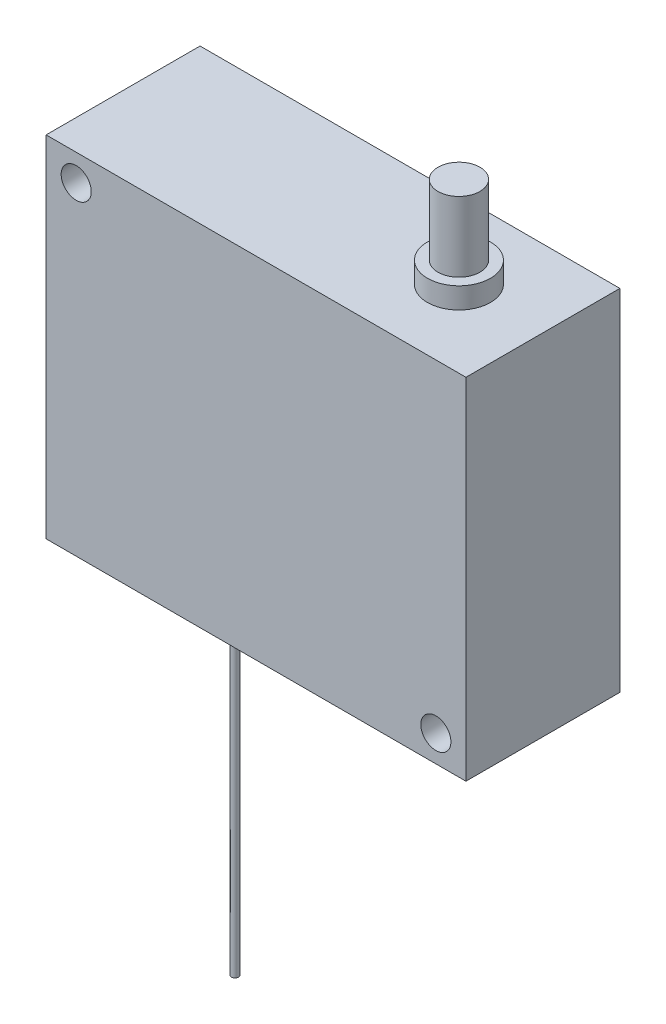
ISO-10303-21;
HEADER;
FILE_DESCRIPTION(('STEP AP214'),'2;1');
FILE_NAME('part.step','',(''),(''),'','','');
FILE_SCHEMA(('AUTOMOTIVE_DESIGN { 1 0 10303 214 1 1 1 1 }'));
ENDSEC;
DATA;
#1=APPLICATION_CONTEXT('core data for automotive mechanical design processes');
#2=APPLICATION_PROTOCOL_DEFINITION('international standard','automotive_design',2000,#1);
#3=PRODUCT_CONTEXT('',#1,'mechanical');
#4=PRODUCT('Part','Part','',(#3));
#5=PRODUCT_RELATED_PRODUCT_CATEGORY('part','',(#4));
#6=PRODUCT_DEFINITION_FORMATION('','',#4);
#7=PRODUCT_DEFINITION_CONTEXT('part definition',#1,'design');
#8=PRODUCT_DEFINITION('design','',#6,#7);
#9=PRODUCT_DEFINITION_SHAPE('','',#8);
#10=(LENGTH_UNIT() NAMED_UNIT(*) SI_UNIT(.MILLI.,.METRE.));
#11=(NAMED_UNIT(*) PLANE_ANGLE_UNIT() SI_UNIT($,.RADIAN.));
#12=(NAMED_UNIT(*) SI_UNIT($,.STERADIAN.) SOLID_ANGLE_UNIT());
#13=UNCERTAINTY_MEASURE_WITH_UNIT(LENGTH_MEASURE(1.E-05),#10,'distance_accuracy_value','');
#14=(GEOMETRIC_REPRESENTATION_CONTEXT(3) GLOBAL_UNCERTAINTY_ASSIGNED_CONTEXT((#13)) GLOBAL_UNIT_ASSIGNED_CONTEXT((#10,
#11,#12)) REPRESENTATION_CONTEXT('',''));
#15=CARTESIAN_POINT('',(0.,0.,0.));
#16=DIRECTION('',(0.,0.,1.));
#17=DIRECTION('',(1.,0.,0.));
#18=AXIS2_PLACEMENT_3D('',#15,#16,#17);
#19=CARTESIAN_POINT('',(0.,0.,22.));
#20=DIRECTION('',(0.,1.,0.));
#21=DIRECTION('',(0.,0.,1.));
#22=AXIS2_PLACEMENT_3D('',#19,#20,#21);
#23=PLANE('',#22);
#24=DIRECTION('',(1.,0.,0.));
#25=VECTOR('',#24,1.);
#26=CARTESIAN_POINT('',(3.,0.,3.5));
#27=LINE('',#26,#25);
#28=CARTESIAN_POINT('',(3.,0.,3.5));
#29=VERTEX_POINT('',#28);
#30=CARTESIAN_POINT('',(42.,0.,3.5));
#31=VERTEX_POINT('',#30);
#32=EDGE_CURVE('E114',#29,#31,#27,.T.);
#33=ORIENTED_EDGE('',*,*,#32,.F.);
#34=DIRECTION('',(0.,0.,-1.));
#35=VECTOR('',#34,1.);
#36=CARTESIAN_POINT('',(3.,0.,11.5));
#37=LINE('',#36,#35);
#38=CARTESIAN_POINT('',(3.,0.,11.5));
#39=VERTEX_POINT('',#38);
#40=EDGE_CURVE('E107',#39,#29,#37,.T.);
#41=ORIENTED_EDGE('',*,*,#40,.F.);
#42=DIRECTION('',(-1.,0.,0.));
#43=VECTOR('',#42,1.);
#44=CARTESIAN_POINT('',(3.,0.,11.5));
#45=LINE('',#44,#43);
#46=CARTESIAN_POINT('',(42.,0.,11.5));
#47=VERTEX_POINT('',#46);
#48=EDGE_CURVE('E129',#47,#39,#45,.T.);
#49=ORIENTED_EDGE('',*,*,#48,.F.);
#50=DIRECTION('',(0.,0.,1.));
#51=VECTOR('',#50,1.);
#52=CARTESIAN_POINT('',(42.,0.,11.5));
#53=LINE('',#52,#51);
#54=EDGE_CURVE('E137',#31,#47,#53,.T.);
#55=ORIENTED_EDGE('',*,*,#54,.F.);
#56=EDGE_LOOP('',(#33,#41,#49,#55));
#57=FACE_BOUND('',#56,.T.);
#58=DIRECTION('',(1.,0.,0.));
#59=VECTOR('',#58,1.);
#60=CARTESIAN_POINT('',(0.,0.,0.));
#61=LINE('',#60,#59);
#62=CARTESIAN_POINT('',(0.,0.,0.));
#63=VERTEX_POINT('',#62);
#64=CARTESIAN_POINT('',(60.,0.,0.));
#65=VERTEX_POINT('',#64);
#66=EDGE_CURVE('E169',#63,#65,#61,.T.);
#67=ORIENTED_EDGE('',*,*,#66,.T.);
#68=DIRECTION('',(0.,0.,-1.));
#69=VECTOR('',#68,1.);
#70=CARTESIAN_POINT('',(60.,0.,22.));
#71=LINE('',#70,#69);
#72=CARTESIAN_POINT('',(60.,0.,22.));
#73=VERTEX_POINT('',#72);
#74=EDGE_CURVE('E158',#73,#65,#71,.T.);
#75=ORIENTED_EDGE('',*,*,#74,.F.);
#76=DIRECTION('',(1.,0.,0.));
#77=VECTOR('',#76,1.);
#78=CARTESIAN_POINT('',(0.,0.,22.));
#79=LINE('',#78,#77);
#80=CARTESIAN_POINT('',(0.,0.,22.));
#81=VERTEX_POINT('',#80);
#82=EDGE_CURVE('E157',#81,#73,#79,.T.);
#83=ORIENTED_EDGE('',*,*,#82,.F.);
#84=DIRECTION('',(0.,0.,-1.));
#85=VECTOR('',#84,1.);
#86=CARTESIAN_POINT('',(0.,0.,22.));
#87=LINE('',#86,#85);
#88=EDGE_CURVE('E153',#81,#63,#87,.T.);
#89=ORIENTED_EDGE('',*,*,#88,.T.);
#90=EDGE_LOOP('',(#67,#75,#83,#89));
#91=FACE_BOUND('',#90,.T.);
#92=ADVANCED_FACE('F44',(#57,#91),#23,.F.);
#93=CARTESIAN_POINT('',(48.,53.,11.));
#94=DIRECTION('',(0.,1.,0.));
#95=DIRECTION('',(0.,0.,1.));
#96=AXIS2_PLACEMENT_3D('',#93,#94,#95);
#97=PLANE('',#96);
#98=CARTESIAN_POINT('',(48.,53.,11.));
#99=DIRECTION('',(0.,1.,0.));
#100=DIRECTION('',(0.,0.,1.));
#101=AXIS2_PLACEMENT_3D('',#98,#99,#100);
#102=CIRCLE('',#101,4.5);
#103=CARTESIAN_POINT('',(48.,53.,15.5));
#104=VERTEX_POINT('',#103);
#105=EDGE_CURVE('E149',#104,#104,#102,.T.);
#106=ORIENTED_EDGE('',*,*,#105,.T.);
#107=EDGE_LOOP('',(#106));
#108=FACE_BOUND('',#107,.T.);
#109=CARTESIAN_POINT('',(48.,53.,11.));
#110=DIRECTION('',(0.,1.,0.));
#111=DIRECTION('',(0.,0.,1.));
#112=AXIS2_PLACEMENT_3D('',#109,#110,#111);
#113=CIRCLE('',#112,3.);
#114=CARTESIAN_POINT('',(48.,53.,14.));
#115=VERTEX_POINT('',#114);
#116=EDGE_CURVE('E145',#115,#115,#113,.T.);
#117=ORIENTED_EDGE('',*,*,#116,.F.);
#118=EDGE_LOOP('',(#117));
#119=FACE_BOUND('',#118,.T.);
#120=ADVANCED_FACE('F243',(#108,#119),#97,.T.);
#121=CARTESIAN_POINT('',(0.,50.,22.));
#122=DIRECTION('',(0.,-1.,0.));
#123=DIRECTION('',(0.,0.,-1.));
#124=AXIS2_PLACEMENT_3D('',#121,#122,#123);
#125=PLANE('',#124);
#126=DIRECTION('',(-1.,0.,0.));
#127=VECTOR('',#126,1.);
#128=CARTESIAN_POINT('',(0.,50.,0.));
#129=LINE('',#128,#127);
#130=CARTESIAN_POINT('',(60.,50.,0.));
#131=VERTEX_POINT('',#130);
#132=CARTESIAN_POINT('',(0.,50.,0.));
#133=VERTEX_POINT('',#132);
#134=EDGE_CURVE('E152',#131,#133,#129,.T.);
#135=ORIENTED_EDGE('',*,*,#134,.T.);
#136=DIRECTION('',(0.,0.,-1.));
#137=VECTOR('',#136,1.);
#138=CARTESIAN_POINT('',(0.,50.,22.));
#139=LINE('',#138,#137);
#140=CARTESIAN_POINT('',(0.,50.,22.));
#141=VERTEX_POINT('',#140);
#142=EDGE_CURVE('E167',#141,#133,#139,.T.);
#143=ORIENTED_EDGE('',*,*,#142,.F.);
#144=DIRECTION('',(-1.,0.,0.));
#145=VECTOR('',#144,1.);
#146=CARTESIAN_POINT('',(0.,50.,22.));
#147=LINE('',#146,#145);
#148=CARTESIAN_POINT('',(60.,50.,22.));
#149=VERTEX_POINT('',#148);
#150=EDGE_CURVE('E162',#149,#141,#147,.T.);
#151=ORIENTED_EDGE('',*,*,#150,.F.);
#152=DIRECTION('',(0.,0.,-1.));
#153=VECTOR('',#152,1.);
#154=CARTESIAN_POINT('',(60.,50.,22.));
#155=LINE('',#154,#153);
#156=EDGE_CURVE('E168',#149,#131,#155,.T.);
#157=ORIENTED_EDGE('',*,*,#156,.T.);
#158=EDGE_LOOP('',(#135,#143,#151,#157));
#159=FACE_BOUND('',#158,.T.);
#160=CARTESIAN_POINT('',(48.,50.,11.));
#161=DIRECTION('',(0.,-1.,0.));
#162=DIRECTION('',(0.,0.,-1.));
#163=AXIS2_PLACEMENT_3D('',#160,#161,#162);
#164=CIRCLE('',#163,4.5);
#165=CARTESIAN_POINT('',(48.,50.,6.5));
#166=VERTEX_POINT('',#165);
#167=EDGE_CURVE('E148',#166,#166,#164,.F.);
#168=ORIENTED_EDGE('',*,*,#167,.F.);
#169=EDGE_LOOP('',(#168));
#170=FACE_BOUND('',#169,.T.);
#171=ADVANCED_FACE('F229',(#159,#170),#125,.F.);
#172=CARTESIAN_POINT('',(0.,0.,22.));
#173=DIRECTION('',(1.,0.,0.));
#174=DIRECTION('',(0.,0.,-1.));
#175=AXIS2_PLACEMENT_3D('',#172,#173,#174);
#176=PLANE('',#175);
#177=DIRECTION('',(0.,-1.,0.));
#178=VECTOR('',#177,1.);
#179=CARTESIAN_POINT('',(0.,0.,0.));
#180=LINE('',#179,#178);
#181=EDGE_CURVE('E164',#133,#63,#180,.T.);
#182=ORIENTED_EDGE('',*,*,#181,.T.);
#183=ORIENTED_EDGE('',*,*,#88,.F.);
#184=DIRECTION('',(0.,-1.,0.));
#185=VECTOR('',#184,1.);
#186=CARTESIAN_POINT('',(0.,0.,22.));
#187=LINE('',#186,#185);
#188=EDGE_CURVE('E154',#141,#81,#187,.T.);
#189=ORIENTED_EDGE('',*,*,#188,.F.);
#190=ORIENTED_EDGE('',*,*,#142,.T.);
#191=EDGE_LOOP('',(#182,#183,#189,#190));
#192=FACE_BOUND('',#191,.T.);
#193=ADVANCED_FACE('F220',(#192),#176,.F.);
#194=CARTESIAN_POINT('',(60.,0.,22.));
#195=DIRECTION('',(-1.,0.,0.));
#196=DIRECTION('',(0.,0.,1.));
#197=AXIS2_PLACEMENT_3D('',#194,#195,#196);
#198=PLANE('',#197);
#199=DIRECTION('',(0.,1.,0.));
#200=VECTOR('',#199,1.);
#201=CARTESIAN_POINT('',(60.,0.,0.));
#202=LINE('',#201,#200);
#203=EDGE_CURVE('E172',#65,#131,#202,.T.);
#204=ORIENTED_EDGE('',*,*,#203,.T.);
#205=ORIENTED_EDGE('',*,*,#156,.F.);
#206=DIRECTION('',(0.,1.,0.));
#207=VECTOR('',#206,1.);
#208=CARTESIAN_POINT('',(60.,0.,22.));
#209=LINE('',#208,#207);
#210=EDGE_CURVE('E160',#73,#149,#209,.T.);
#211=ORIENTED_EDGE('',*,*,#210,.F.);
#212=ORIENTED_EDGE('',*,*,#74,.T.);
#213=EDGE_LOOP('',(#204,#205,#211,#212));
#214=FACE_BOUND('',#213,.T.);
#215=ADVANCED_FACE('F210',(#214),#198,.F.);
#216=CARTESIAN_POINT('',(0.,0.,22.));
#217=DIRECTION('',(0.,0.,-1.));
#218=DIRECTION('',(-1.,0.,0.));
#219=AXIS2_PLACEMENT_3D('',#216,#217,#218);
#220=PLANE('',#219);
#221=CARTESIAN_POINT('',(4.30000000000001,46.2,22.));
#222=DIRECTION('',(0.,0.,1.));
#223=DIRECTION('',(1.,0.,0.));
#224=AXIS2_PLACEMENT_3D('',#221,#222,#223);
#225=CIRCLE('',#224,2.15);
#226=CARTESIAN_POINT('',(6.45000000000001,46.2,22.));
#227=VERTEX_POINT('',#226);
#228=EDGE_CURVE('E191',#227,#227,#225,.T.);
#229=ORIENTED_EDGE('',*,*,#228,.F.);
#230=EDGE_LOOP('',(#229));
#231=FACE_BOUND('',#230,.T.);
#232=CARTESIAN_POINT('',(55.7,3.8,22.));
#233=DIRECTION('',(0.,0.,1.));
#234=DIRECTION('',(1.,0.,0.));
#235=AXIS2_PLACEMENT_3D('',#232,#233,#234);
#236=CIRCLE('',#235,2.15);
#237=CARTESIAN_POINT('',(57.85,3.8,22.));
#238=VERTEX_POINT('',#237);
#239=EDGE_CURVE('E185',#238,#238,#236,.T.);
#240=ORIENTED_EDGE('',*,*,#239,.F.);
#241=EDGE_LOOP('',(#240));
#242=FACE_BOUND('',#241,.T.);
#243=ORIENTED_EDGE('',*,*,#188,.T.);
#244=ORIENTED_EDGE('',*,*,#82,.T.);
#245=ORIENTED_EDGE('',*,*,#210,.T.);
#246=ORIENTED_EDGE('',*,*,#150,.T.);
#247=EDGE_LOOP('',(#243,#244,#245,#246));
#248=FACE_BOUND('',#247,.T.);
#249=ADVANCED_FACE('F207',(#231,#242,#248),#220,.F.);
#250=CARTESIAN_POINT('',(0.,0.,0.));
#251=DIRECTION('',(0.,0.,-1.));
#252=DIRECTION('',(-1.,0.,0.));
#253=AXIS2_PLACEMENT_3D('',#250,#251,#252);
#254=PLANE('',#253);
#255=CARTESIAN_POINT('',(4.30000000000001,46.2,0.));
#256=DIRECTION('',(0.,0.,1.));
#257=DIRECTION('',(1.,0.,0.));
#258=AXIS2_PLACEMENT_3D('',#255,#256,#257);
#259=CIRCLE('',#258,2.15);
#260=CARTESIAN_POINT('',(6.45000000000001,46.2,0.));
#261=VERTEX_POINT('',#260);
#262=EDGE_CURVE('E188',#261,#261,#259,.T.);
#263=ORIENTED_EDGE('',*,*,#262,.T.);
#264=EDGE_LOOP('',(#263));
#265=FACE_BOUND('',#264,.T.);
#266=CARTESIAN_POINT('',(55.7,3.8,0.));
#267=DIRECTION('',(0.,0.,1.));
#268=DIRECTION('',(1.,0.,0.));
#269=AXIS2_PLACEMENT_3D('',#266,#267,#268);
#270=CIRCLE('',#269,2.15);
#271=CARTESIAN_POINT('',(57.85,3.8,0.));
#272=VERTEX_POINT('',#271);
#273=EDGE_CURVE('E171',#272,#272,#270,.T.);
#274=ORIENTED_EDGE('',*,*,#273,.T.);
#275=EDGE_LOOP('',(#274));
#276=FACE_BOUND('',#275,.T.);
#277=ORIENTED_EDGE('',*,*,#181,.F.);
#278=ORIENTED_EDGE('',*,*,#134,.F.);
#279=ORIENTED_EDGE('',*,*,#203,.F.);
#280=ORIENTED_EDGE('',*,*,#66,.F.);
#281=EDGE_LOOP('',(#277,#278,#279,#280));
#282=FACE_BOUND('',#281,.T.);
#283=ADVANCED_FACE('F197',(#265,#276,#282),#254,.T.);
#284=CARTESIAN_POINT('',(48.,53.,11.));
#285=DIRECTION('',(0.,-1.,0.));
#286=DIRECTION('',(0.,0.,-1.));
#287=AXIS2_PLACEMENT_3D('',#284,#285,#286);
#288=CYLINDRICAL_SURFACE('',#287,4.5);
#289=ORIENTED_EDGE('',*,*,#105,.F.);
#290=EDGE_LOOP('',(#289));
#291=FACE_BOUND('',#290,.T.);
#292=ORIENTED_EDGE('',*,*,#167,.T.);
#293=EDGE_LOOP('',(#292));
#294=FACE_BOUND('',#293,.T.);
#295=ADVANCED_FACE('F233',(#291,#294),#288,.T.);
#296=CARTESIAN_POINT('',(48.,63.,11.));
#297=DIRECTION('',(0.,-1.,0.));
#298=DIRECTION('',(0.,0.,-1.));
#299=AXIS2_PLACEMENT_3D('',#296,#297,#298);
#300=CYLINDRICAL_SURFACE('',#299,3.);
#301=CARTESIAN_POINT('',(48.,63.,11.));
#302=DIRECTION('',(0.,1.,0.));
#303=DIRECTION('',(0.,0.,1.));
#304=AXIS2_PLACEMENT_3D('',#301,#302,#303);
#305=CIRCLE('',#304,3.);
#306=CARTESIAN_POINT('',(48.,63.,14.));
#307=VERTEX_POINT('',#306);
#308=EDGE_CURVE('E132',#307,#307,#305,.T.);
#309=ORIENTED_EDGE('',*,*,#308,.F.);
#310=EDGE_LOOP('',(#309));
#311=FACE_BOUND('',#310,.T.);
#312=ORIENTED_EDGE('',*,*,#116,.T.);
#313=EDGE_LOOP('',(#312));
#314=FACE_BOUND('',#313,.T.);
#315=ADVANCED_FACE('F238',(#311,#314),#300,.T.);
#316=CARTESIAN_POINT('',(48.,63.,11.));
#317=DIRECTION('',(0.,1.,0.));
#318=DIRECTION('',(0.,0.,1.));
#319=AXIS2_PLACEMENT_3D('',#316,#317,#318);
#320=PLANE('',#319);
#321=ORIENTED_EDGE('',*,*,#308,.T.);
#322=EDGE_LOOP('',(#321));
#323=FACE_BOUND('',#322,.T.);
#324=ADVANCED_FACE('F320',(#323),#320,.T.);
#325=CARTESIAN_POINT('',(3.,0.01,11.5));
#326=DIRECTION('',(-1.,0.,0.));
#327=DIRECTION('',(0.,0.,1.));
#328=AXIS2_PLACEMENT_3D('',#325,#326,#327);
#329=PLANE('',#328);
#330=ORIENTED_EDGE('',*,*,#40,.T.);
#331=DIRECTION('',(0.,-1.,0.));
#332=VECTOR('',#331,1.);
#333=CARTESIAN_POINT('',(3.,0.01,3.5));
#334=LINE('',#333,#332);
#335=CARTESIAN_POINT('',(3.,0.01,3.5));
#336=VERTEX_POINT('',#335);
#337=EDGE_CURVE('E110',#336,#29,#334,.T.);
#338=ORIENTED_EDGE('',*,*,#337,.F.);
#339=DIRECTION('',(0.,0.,-1.));
#340=VECTOR('',#339,1.);
#341=CARTESIAN_POINT('',(3.,0.01,11.5));
#342=LINE('',#341,#340);
#343=CARTESIAN_POINT('',(3.,0.01,11.5));
#344=VERTEX_POINT('',#343);
#345=EDGE_CURVE('E48',#344,#336,#342,.T.);
#346=ORIENTED_EDGE('',*,*,#345,.F.);
#347=DIRECTION('',(0.,-1.,0.));
#348=VECTOR('',#347,1.);
#349=CARTESIAN_POINT('',(3.,0.01,11.5));
#350=LINE('',#349,#348);
#351=EDGE_CURVE('E127',#344,#39,#350,.T.);
#352=ORIENTED_EDGE('',*,*,#351,.T.);
#353=EDGE_LOOP('',(#330,#338,#346,#352));
#354=FACE_BOUND('',#353,.T.);
#355=ADVANCED_FACE('F111',(#354),#329,.F.);
#356=CARTESIAN_POINT('',(3.,0.01,11.5));
#357=DIRECTION('',(0.,0.,1.));
#358=DIRECTION('',(1.,0.,0.));
#359=AXIS2_PLACEMENT_3D('',#356,#357,#358);
#360=PLANE('',#359);
#361=ORIENTED_EDGE('',*,*,#48,.T.);
#362=ORIENTED_EDGE('',*,*,#351,.F.);
#363=DIRECTION('',(-1.,0.,0.));
#364=VECTOR('',#363,1.);
#365=CARTESIAN_POINT('',(3.,0.01,11.5));
#366=LINE('',#365,#364);
#367=CARTESIAN_POINT('',(42.,0.01,11.5));
#368=VERTEX_POINT('',#367);
#369=EDGE_CURVE('E12',#368,#344,#366,.T.);
#370=ORIENTED_EDGE('',*,*,#369,.F.);
#371=DIRECTION('',(0.,-1.,0.));
#372=VECTOR('',#371,1.);
#373=CARTESIAN_POINT('',(42.,0.01,11.5));
#374=LINE('',#373,#372);
#375=EDGE_CURVE('E125',#368,#47,#374,.T.);
#376=ORIENTED_EDGE('',*,*,#375,.T.);
#377=EDGE_LOOP('',(#361,#362,#370,#376));
#378=FACE_BOUND('',#377,.T.);
#379=ADVANCED_FACE('F124',(#378),#360,.F.);
#380=CARTESIAN_POINT('',(42.,0.01,11.5));
#381=DIRECTION('',(1.,0.,0.));
#382=DIRECTION('',(0.,0.,-1.));
#383=AXIS2_PLACEMENT_3D('',#380,#381,#382);
#384=PLANE('',#383);
#385=ORIENTED_EDGE('',*,*,#54,.T.);
#386=ORIENTED_EDGE('',*,*,#375,.F.);
#387=DIRECTION('',(0.,0.,1.));
#388=VECTOR('',#387,1.);
#389=CARTESIAN_POINT('',(42.,0.01,11.5));
#390=LINE('',#389,#388);
#391=CARTESIAN_POINT('',(42.,0.01,3.5));
#392=VERTEX_POINT('',#391);
#393=EDGE_CURVE('E54',#392,#368,#390,.T.);
#394=ORIENTED_EDGE('',*,*,#393,.F.);
#395=DIRECTION('',(0.,-1.,0.));
#396=VECTOR('',#395,1.);
#397=CARTESIAN_POINT('',(42.,0.01,3.5));
#398=LINE('',#397,#396);
#399=EDGE_CURVE('E62',#392,#31,#398,.T.);
#400=ORIENTED_EDGE('',*,*,#399,.T.);
#401=EDGE_LOOP('',(#385,#386,#394,#400));
#402=FACE_BOUND('',#401,.T.);
#403=ADVANCED_FACE('F302',(#402),#384,.F.);
#404=CARTESIAN_POINT('',(3.,0.01,3.5));
#405=DIRECTION('',(0.,0.,-1.));
#406=DIRECTION('',(-1.,0.,0.));
#407=AXIS2_PLACEMENT_3D('',#404,#405,#406);
#408=PLANE('',#407);
#409=ORIENTED_EDGE('',*,*,#32,.T.);
#410=ORIENTED_EDGE('',*,*,#399,.F.);
#411=DIRECTION('',(1.,0.,0.));
#412=VECTOR('',#411,1.);
#413=CARTESIAN_POINT('',(3.,0.01,3.5));
#414=LINE('',#413,#412);
#415=EDGE_CURVE('E117',#336,#392,#414,.T.);
#416=ORIENTED_EDGE('',*,*,#415,.F.);
#417=ORIENTED_EDGE('',*,*,#337,.T.);
#418=EDGE_LOOP('',(#409,#410,#416,#417));
#419=FACE_BOUND('',#418,.T.);
#420=ADVANCED_FACE('F118',(#419),#408,.F.);
#421=CARTESIAN_POINT('',(0.,0.01,0.));
#422=DIRECTION('',(0.,-1.,0.));
#423=DIRECTION('',(0.,0.,-1.));
#424=AXIS2_PLACEMENT_3D('',#421,#422,#423);
#425=PLANE('',#424);
#426=ORIENTED_EDGE('',*,*,#345,.T.);
#427=ORIENTED_EDGE('',*,*,#415,.T.);
#428=ORIENTED_EDGE('',*,*,#393,.T.);
#429=ORIENTED_EDGE('',*,*,#369,.T.);
#430=EDGE_LOOP('',(#426,#427,#428,#429));
#431=FACE_BOUND('',#430,.T.);
#432=ADVANCED_FACE('F46',(#431),#425,.T.);
#433=CARTESIAN_POINT('',(55.7,3.8,0.));
#434=DIRECTION('',(0.,0.,1.));
#435=DIRECTION('',(1.,0.,0.));
#436=AXIS2_PLACEMENT_3D('',#433,#434,#435);
#437=CYLINDRICAL_SURFACE('',#436,2.15);
#438=ORIENTED_EDGE('',*,*,#273,.F.);
#439=EDGE_LOOP('',(#438));
#440=FACE_BOUND('',#439,.T.);
#441=ORIENTED_EDGE('',*,*,#239,.T.);
#442=EDGE_LOOP('',(#441));
#443=FACE_BOUND('',#442,.T.);
#444=ADVANCED_FACE('F203',(#440,#443),#437,.F.);
#445=CARTESIAN_POINT('',(4.30000000000001,46.2,0.));
#446=DIRECTION('',(0.,0.,1.));
#447=DIRECTION('',(1.,0.,0.));
#448=AXIS2_PLACEMENT_3D('',#445,#446,#447);
#449=CYLINDRICAL_SURFACE('',#448,2.15);
#450=ORIENTED_EDGE('',*,*,#262,.F.);
#451=EDGE_LOOP('',(#450));
#452=FACE_BOUND('',#451,.T.);
#453=ORIENTED_EDGE('',*,*,#228,.T.);
#454=EDGE_LOOP('',(#453));
#455=FACE_BOUND('',#454,.T.);
#456=ADVANCED_FACE('F200',(#452,#455),#449,.F.);
#457=CLOSED_SHELL('',(#92,#120,#171,#193,#215,#249,#283,#295,#315,#324,#355,#379,#403,#420,#432,
#444,#456));
#458=MANIFOLD_SOLID_BREP('B2',#457);
#459=CARTESIAN_POINT('',(12.5,-55.,7.5));
#460=DIRECTION('',(0.,-1.,0.));
#461=DIRECTION('',(0.,0.,-1.));
#462=AXIS2_PLACEMENT_3D('',#459,#460,#461);
#463=PLANE('',#462);
#464=CARTESIAN_POINT('',(12.5,-55.,7.5));
#465=DIRECTION('',(0.,-1.,0.));
#466=DIRECTION('',(0.,0.,-1.));
#467=AXIS2_PLACEMENT_3D('',#464,#465,#466);
#468=CIRCLE('',#467,0.500000000000001);
#469=CARTESIAN_POINT('',(12.5,-55.,7.));
#470=VERTEX_POINT('',#469);
#471=EDGE_CURVE('E43',#470,#470,#468,.T.);
#472=ORIENTED_EDGE('',*,*,#471,.T.);
#473=EDGE_LOOP('',(#472));
#474=FACE_BOUND('',#473,.T.);
#475=ADVANCED_FACE('F384',(#474),#463,.T.);
#476=CARTESIAN_POINT('',(12.5,-55.,7.5));
#477=DIRECTION('',(0.,1.,0.));
#478=DIRECTION('',(0.,0.,1.));
#479=AXIS2_PLACEMENT_3D('',#476,#477,#478);
#480=CYLINDRICAL_SURFACE('',#479,0.500000000000001);
#481=ORIENTED_EDGE('',*,*,#471,.F.);
#482=EDGE_LOOP('',(#481));
#483=FACE_BOUND('',#482,.T.);
#484=CARTESIAN_POINT('',(12.5,0.,7.5));
#485=DIRECTION('',(0.,-1.,0.));
#486=DIRECTION('',(0.,0.,-1.));
#487=AXIS2_PLACEMENT_3D('',#484,#485,#486);
#488=CIRCLE('',#487,0.500000000000001);
#489=CARTESIAN_POINT('',(12.5,0.,7.));
#490=VERTEX_POINT('',#489);
#491=EDGE_CURVE('E391',#490,#490,#488,.T.);
#492=ORIENTED_EDGE('',*,*,#491,.T.);
#493=EDGE_LOOP('',(#492));
#494=FACE_BOUND('',#493,.T.);
#495=ADVANCED_FACE('F386',(#483,#494),#480,.T.);
#496=CARTESIAN_POINT('',(0.,0.,0.));
#497=DIRECTION('',(0.,-1.,0.));
#498=DIRECTION('',(0.,0.,-1.));
#499=AXIS2_PLACEMENT_3D('',#496,#497,#498);
#500=PLANE('',#499);
#501=ORIENTED_EDGE('',*,*,#491,.F.);
#502=EDGE_LOOP('',(#501));
#503=FACE_BOUND('',#502,.T.);
#504=ADVANCED_FACE('F398',(#503),#500,.F.);
#505=CLOSED_SHELL('',(#475,#495,#504));
#506=MANIFOLD_SOLID_BREP('B6',#505);
#507=ADVANCED_BREP_SHAPE_REPRESENTATION('',(#18,#458,#506),#14);
#508=SHAPE_DEFINITION_REPRESENTATION(#9,#507);
ENDSEC;
END-ISO-10303-21;
